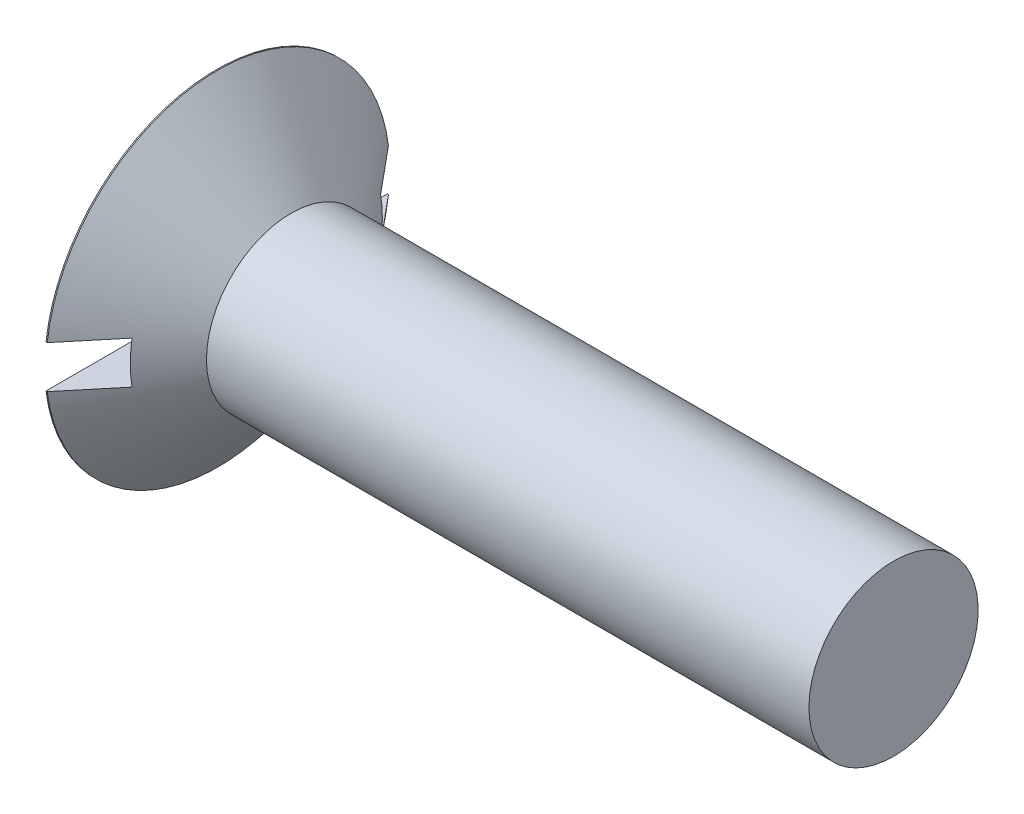
ISO-10303-21;
HEADER;
FILE_DESCRIPTION(('STEP AP214'),'2;1');
FILE_NAME('part.step','',(''),(''),'','','');
FILE_SCHEMA(('AUTOMOTIVE_DESIGN { 1 0 10303 214 1 1 1 1 }'));
ENDSEC;
DATA;
#1=APPLICATION_CONTEXT('core data for automotive mechanical design processes');
#2=APPLICATION_PROTOCOL_DEFINITION('international standard','automotive_design',2000,#1);
#3=PRODUCT_CONTEXT('',#1,'mechanical');
#4=PRODUCT('Part','Part','',(#3));
#5=PRODUCT_RELATED_PRODUCT_CATEGORY('part','',(#4));
#6=PRODUCT_DEFINITION_FORMATION('','',#4);
#7=PRODUCT_DEFINITION_CONTEXT('part definition',#1,'design');
#8=PRODUCT_DEFINITION('design','',#6,#7);
#9=PRODUCT_DEFINITION_SHAPE('','',#8);
#10=(LENGTH_UNIT() NAMED_UNIT(*) SI_UNIT(.MILLI.,.METRE.));
#11=(NAMED_UNIT(*) PLANE_ANGLE_UNIT() SI_UNIT($,.RADIAN.));
#12=(NAMED_UNIT(*) SI_UNIT($,.STERADIAN.) SOLID_ANGLE_UNIT());
#13=UNCERTAINTY_MEASURE_WITH_UNIT(LENGTH_MEASURE(1.E-05),#10,'distance_accuracy_value','');
#14=(GEOMETRIC_REPRESENTATION_CONTEXT(3) GLOBAL_UNCERTAINTY_ASSIGNED_CONTEXT((#13)) GLOBAL_UNIT_ASSIGNED_CONTEXT((#10,
#11,#12)) REPRESENTATION_CONTEXT('',''));
#15=CARTESIAN_POINT('',(0.,0.,0.));
#16=DIRECTION('',(0.,0.,1.));
#17=DIRECTION('',(1.,0.,0.));
#18=AXIS2_PLACEMENT_3D('',#15,#16,#17);
#19=CARTESIAN_POINT('',(2.2352,1.1938,-9.67739999999999));
#20=DIRECTION('',(-1.,0.,0.));
#21=DIRECTION('',(0.,0.,1.));
#22=AXIS2_PLACEMENT_3D('',#19,#20,#21);
#23=PLANE('',#22);
#24=DIRECTION('',(0.,-1.,0.));
#25=VECTOR('',#24,1.);
#26=CARTESIAN_POINT('',(2.2352,1.19379999999995,4.93366687898089));
#27=LINE('',#26,#25);
#28=CARTESIAN_POINT('',(2.2352,0.93915286624202,4.93366687898089));
#29=VERTEX_POINT('',#28);
#30=CARTESIAN_POINT('',(2.2352,-0.939152866242055,4.93366687898089));
#31=VERTEX_POINT('',#30);
#32=EDGE_CURVE('E326',#29,#31,#27,.T.);
#33=ORIENTED_EDGE('',*,*,#32,.T.);
#34=DIRECTION('',(0.,0.,-1.));
#35=VECTOR('',#34,1.);
#36=CARTESIAN_POINT('',(2.2352,-0.939152866242006,-9.6774));
#37=LINE('',#36,#35);
#38=CARTESIAN_POINT('',(2.2352,-0.939152866242041,0.939152866242038));
#39=VERTEX_POINT('',#38);
#40=EDGE_CURVE('E170',#31,#39,#37,.T.);
#41=ORIENTED_EDGE('',*,*,#40,.T.);
#42=DIRECTION('',(0.,-1.,0.));
#43=VECTOR('',#42,1.);
#44=CARTESIAN_POINT('',(2.2352,1.1938,0.939152866242037));
#45=LINE('',#44,#43);
#46=CARTESIAN_POINT('',(2.2352,-1.1938,0.939152866242037));
#47=VERTEX_POINT('',#46);
#48=EDGE_CURVE('E47',#39,#47,#45,.T.);
#49=ORIENTED_EDGE('',*,*,#48,.T.);
#50=DIRECTION('',(0.,0.,1.));
#51=VECTOR('',#50,1.);
#52=CARTESIAN_POINT('',(2.2352,-1.1938,-9.6774));
#53=LINE('',#52,#51);
#54=CARTESIAN_POINT('',(2.2352,-1.1938,6.99215244623282));
#55=VERTEX_POINT('',#54);
#56=EDGE_CURVE('E62',#47,#55,#53,.T.);
#57=ORIENTED_EDGE('',*,*,#56,.T.);
#58=CARTESIAN_POINT('',(2.2352,0.,0.));
#59=DIRECTION('',(-1.,0.,0.));
#60=DIRECTION('',(0.,0.,1.));
#61=AXIS2_PLACEMENT_3D('',#58,#59,#60);
#62=CIRCLE('',#61,7.09333167639577);
#63=CARTESIAN_POINT('',(2.2352,1.1938,6.99215244623282));
#64=VERTEX_POINT('',#63);
#65=EDGE_CURVE('E271',#64,#55,#62,.F.);
#66=ORIENTED_EDGE('',*,*,#65,.F.);
#67=DIRECTION('',(0.,0.,-1.));
#68=VECTOR('',#67,1.);
#69=CARTESIAN_POINT('',(2.2352,1.1938,9.6774));
#70=LINE('',#69,#68);
#71=CARTESIAN_POINT('',(2.2352,1.1938,0.939152866242037));
#72=VERTEX_POINT('',#71);
#73=EDGE_CURVE('E235',#64,#72,#70,.T.);
#74=ORIENTED_EDGE('',*,*,#73,.T.);
#75=CARTESIAN_POINT('',(2.2352,0.939152866242034,0.939152866242037));
#76=VERTEX_POINT('',#75);
#77=EDGE_CURVE('E11',#72,#76,#45,.T.);
#78=ORIENTED_EDGE('',*,*,#77,.T.);
#79=DIRECTION('',(0.,0.,1.));
#80=VECTOR('',#79,1.);
#81=CARTESIAN_POINT('',(2.2352,0.939152866242072,-9.67739999999999));
#82=LINE('',#81,#80);
#83=EDGE_CURVE('E327',#76,#29,#82,.T.);
#84=ORIENTED_EDGE('',*,*,#83,.T.);
#85=EDGE_LOOP('',(#33,#41,#49,#57,#66,#74,#78,#84));
#86=FACE_BOUND('',#85,.T.);
#87=ADVANCED_FACE('F39',(#86),#23,.T.);
#88=DIRECTION('',(0.,1.,0.));
#89=VECTOR('',#88,1.);
#90=CARTESIAN_POINT('',(2.2352,1.1938,-0.939152866242039));
#91=LINE('',#90,#89);
#92=CARTESIAN_POINT('',(2.2352,-1.1938,-0.939152866242039));
#93=VERTEX_POINT('',#92);
#94=CARTESIAN_POINT('',(2.2352,-0.939152866242035,-0.939152866242038));
#95=VERTEX_POINT('',#94);
#96=EDGE_CURVE('E399',#93,#95,#91,.T.);
#97=ORIENTED_EDGE('',*,*,#96,.T.);
#98=DIRECTION('',(0.,0.,-1.));
#99=VECTOR('',#98,1.);
#100=CARTESIAN_POINT('',(2.2352,-0.939152866242006,-9.6774));
#101=LINE('',#100,#99);
#102=CARTESIAN_POINT('',(2.2352,-0.939152866242022,-4.9336668789809));
#103=VERTEX_POINT('',#102);
#104=EDGE_CURVE('E196',#95,#103,#101,.T.);
#105=ORIENTED_EDGE('',*,*,#104,.T.);
#106=DIRECTION('',(0.,1.,0.));
#107=VECTOR('',#106,1.);
#108=CARTESIAN_POINT('',(2.2352,1.19379999999998,-4.93366687898089));
#109=LINE('',#108,#107);
#110=CARTESIAN_POINT('',(2.2352,0.939152866242055,-4.93366687898089));
#111=VERTEX_POINT('',#110);
#112=EDGE_CURVE('E342',#103,#111,#109,.T.);
#113=ORIENTED_EDGE('',*,*,#112,.T.);
#114=DIRECTION('',(0.,0.,1.));
#115=VECTOR('',#114,1.);
#116=CARTESIAN_POINT('',(2.2352,0.939152866242072,-9.67739999999999));
#117=LINE('',#116,#115);
#118=CARTESIAN_POINT('',(2.2352,0.939152866242041,-0.939152866242038));
#119=VERTEX_POINT('',#118);
#120=EDGE_CURVE('E332',#111,#119,#117,.T.);
#121=ORIENTED_EDGE('',*,*,#120,.T.);
#122=CARTESIAN_POINT('',(2.2352,1.1938,-0.939152866242035));
#123=VERTEX_POINT('',#122);
#124=EDGE_CURVE('E54',#119,#123,#91,.T.);
#125=ORIENTED_EDGE('',*,*,#124,.T.);
#126=CARTESIAN_POINT('',(2.2352,1.1938,-6.99215244623282));
#127=VERTEX_POINT('',#126);
#128=EDGE_CURVE('E238',#123,#127,#70,.T.);
#129=ORIENTED_EDGE('',*,*,#128,.T.);
#130=CARTESIAN_POINT('',(2.2352,-1.1938,-6.99215244623282));
#131=VERTEX_POINT('',#130);
#132=EDGE_CURVE('E275',#131,#127,#62,.F.);
#133=ORIENTED_EDGE('',*,*,#132,.F.);
#134=EDGE_CURVE('E239',#131,#93,#53,.T.);
#135=ORIENTED_EDGE('',*,*,#134,.T.);
#136=EDGE_LOOP('',(#97,#105,#113,#121,#125,#129,#133,#135));
#137=FACE_BOUND('',#136,.T.);
#138=ADVANCED_FACE('F320',(#137),#23,.T.);
#139=CARTESIAN_POINT('',(8.69008083333333,0.,0.497178541666667));
#140=DIRECTION('',(-0.0683113918583954,0.,-0.997664048536565));
#141=DIRECTION('',(-0.997664048536565,0.,0.0683113918583954));
#142=AXIS2_PLACEMENT_3D('',#139,#140,#141);
#143=PLANE('',#142);
#144=ORIENTED_EDGE('',*,*,#48,.F.);
#145=DIRECTION('',(0.995344390972083,0.0681525618022289,-0.0681525618022287));
#146=VECTOR('',#145,1.);
#147=CARTESIAN_POINT('',(8.72380707400527,-0.494869260856328,0.494869260856327));
#148=LINE('',#147,#146);
#149=CARTESIAN_POINT('',(7.9756,-0.546100000000002,0.546099999999999));
#150=VERTEX_POINT('',#149);
#151=EDGE_CURVE('E168',#39,#150,#148,.T.);
#152=ORIENTED_EDGE('',*,*,#151,.T.);
#153=DIRECTION('',(0.793328420082592,0.606365671400707,-0.0543202580629801));
#154=VECTOR('',#153,1.);
#155=CARTESIAN_POINT('',(0.,-6.6421,1.0922));
#156=LINE('',#155,#154);
#157=CARTESIAN_POINT('',(0.,-6.6421,1.0922));
#158=VERTEX_POINT('',#157);
#159=EDGE_CURVE('E193',#158,#150,#156,.T.);
#160=ORIENTED_EDGE('',*,*,#159,.F.);
#161=DIRECTION('',(0.,-1.,0.));
#162=VECTOR('',#161,1.);
#163=CARTESIAN_POINT('',(0.,6.6421,1.0922));
#164=LINE('',#163,#162);
#165=CARTESIAN_POINT('',(0.,-1.1938,1.0922));
#166=VERTEX_POINT('',#165);
#167=EDGE_CURVE('E354',#166,#158,#164,.T.);
#168=ORIENTED_EDGE('',*,*,#167,.F.);
#169=DIRECTION('',(0.997664048536565,0.,-0.0683113918583954));
#170=VECTOR('',#169,1.);
#171=CARTESIAN_POINT('',(2.95873739744039,-1.1938,0.889611292850418));
#172=LINE('',#171,#170);
#173=EDGE_CURVE('E230',#166,#47,#172,.T.);
#174=ORIENTED_EDGE('',*,*,#173,.T.);
#175=EDGE_LOOP('',(#144,#152,#160,#168,#174));
#176=FACE_BOUND('',#175,.T.);
#177=ADVANCED_FACE('F191',(#176),#143,.T.);
#178=DIRECTION('',(0.793328420082592,-0.606365671400707,-0.05432025806298));
#179=VECTOR('',#178,1.);
#180=CARTESIAN_POINT('',(0.,6.6421,1.0922));
#181=LINE('',#180,#179);
#182=CARTESIAN_POINT('',(0.,6.6421,1.0922));
#183=VERTEX_POINT('',#182);
#184=CARTESIAN_POINT('',(7.9756,0.546100000000001,0.5461));
#185=VERTEX_POINT('',#184);
#186=EDGE_CURVE('E216',#183,#185,#181,.T.);
#187=ORIENTED_EDGE('',*,*,#186,.T.);
#188=DIRECTION('',(-0.995344390972083,0.0681525618022283,0.0681525618022286));
#189=VECTOR('',#188,1.);
#190=CARTESIAN_POINT('',(8.72380707400527,0.494869260856325,0.494869260856327));
#191=LINE('',#190,#189);
#192=EDGE_CURVE('E338',#185,#76,#191,.T.);
#193=ORIENTED_EDGE('',*,*,#192,.T.);
#194=ORIENTED_EDGE('',*,*,#77,.F.);
#195=DIRECTION('',(-0.997664048536565,0.,0.0683113918583954));
#196=VECTOR('',#195,1.);
#197=CARTESIAN_POINT('',(1.63967255629894,1.1938,0.979929426877621));
#198=LINE('',#197,#196);
#199=CARTESIAN_POINT('',(0.,1.1938,1.0922));
#200=VERTEX_POINT('',#199);
#201=EDGE_CURVE('E232',#72,#200,#198,.T.);
#202=ORIENTED_EDGE('',*,*,#201,.T.);
#203=EDGE_CURVE('E355',#183,#200,#164,.T.);
#204=ORIENTED_EDGE('',*,*,#203,.F.);
#205=EDGE_LOOP('',(#187,#193,#194,#202,#204));
#206=FACE_BOUND('',#205,.T.);
#207=ADVANCED_FACE('F375',(#206),#143,.T.);
#208=CARTESIAN_POINT('',(8.69008083333333,0.,-0.497178541666667));
#209=DIRECTION('',(-0.0683113918583953,0.,0.997664048536565));
#210=DIRECTION('',(0.997664048536565,0.,0.0683113918583953));
#211=AXIS2_PLACEMENT_3D('',#208,#209,#210);
#212=PLANE('',#211);
#213=DIRECTION('',(0.793328420082592,0.606365671400707,0.0543202580629799));
#214=VECTOR('',#213,1.);
#215=CARTESIAN_POINT('',(0.,-6.6421,-1.0922));
#216=LINE('',#215,#214);
#217=CARTESIAN_POINT('',(0.,-6.6421,-1.0922));
#218=VERTEX_POINT('',#217);
#219=CARTESIAN_POINT('',(7.9756,-0.5461,-0.5461));
#220=VERTEX_POINT('',#219);
#221=EDGE_CURVE('E211',#218,#220,#216,.T.);
#222=ORIENTED_EDGE('',*,*,#221,.T.);
#223=DIRECTION('',(-0.995344390972083,-0.0681525618022284,-0.0681525618022285));
#224=VECTOR('',#223,1.);
#225=CARTESIAN_POINT('',(8.72380707400527,-0.494869260856325,-0.494869260856327));
#226=LINE('',#225,#224);
#227=EDGE_CURVE('E345',#220,#95,#226,.T.);
#228=ORIENTED_EDGE('',*,*,#227,.T.);
#229=ORIENTED_EDGE('',*,*,#96,.F.);
#230=DIRECTION('',(-0.997664048536565,0.,-0.0683113918583953));
#231=VECTOR('',#230,1.);
#232=CARTESIAN_POINT('',(1.63967255629895,-1.1938,-0.979929426877619));
#233=LINE('',#232,#231);
#234=CARTESIAN_POINT('',(0.,-1.1938,-1.0922));
#235=VERTEX_POINT('',#234);
#236=EDGE_CURVE('E226',#93,#235,#233,.T.);
#237=ORIENTED_EDGE('',*,*,#236,.T.);
#238=DIRECTION('',(0.,1.,0.));
#239=VECTOR('',#238,1.);
#240=CARTESIAN_POINT('',(0.,-6.6421,-1.0922));
#241=LINE('',#240,#239);
#242=EDGE_CURVE('E214',#218,#235,#241,.T.);
#243=ORIENTED_EDGE('',*,*,#242,.F.);
#244=EDGE_LOOP('',(#222,#228,#229,#237,#243));
#245=FACE_BOUND('',#244,.T.);
#246=ADVANCED_FACE('F398',(#245),#212,.T.);
#247=ORIENTED_EDGE('',*,*,#124,.F.);
#248=DIRECTION('',(0.995344390972083,-0.0681525618022288,0.0681525618022285));
#249=VECTOR('',#248,1.);
#250=CARTESIAN_POINT('',(8.72380707400527,0.494869260856329,-0.494869260856327));
#251=LINE('',#250,#249);
#252=CARTESIAN_POINT('',(7.9756,0.546100000000002,-0.546099999999998));
#253=VERTEX_POINT('',#252);
#254=EDGE_CURVE('E328',#119,#253,#251,.T.);
#255=ORIENTED_EDGE('',*,*,#254,.T.);
#256=DIRECTION('',(0.793328420082592,-0.606365671400707,0.0543202580629799));
#257=VECTOR('',#256,1.);
#258=CARTESIAN_POINT('',(0.,6.6421,-1.0922));
#259=LINE('',#258,#257);
#260=CARTESIAN_POINT('',(0.,6.6421,-1.0922));
#261=VERTEX_POINT('',#260);
#262=EDGE_CURVE('E205',#261,#253,#259,.T.);
#263=ORIENTED_EDGE('',*,*,#262,.F.);
#264=CARTESIAN_POINT('',(0.,1.1938,-1.0922));
#265=VERTEX_POINT('',#264);
#266=EDGE_CURVE('E210',#265,#261,#241,.T.);
#267=ORIENTED_EDGE('',*,*,#266,.F.);
#268=DIRECTION('',(0.997664048536565,0.,0.0683113918583953));
#269=VECTOR('',#268,1.);
#270=CARTESIAN_POINT('',(2.95873739744039,1.1938,-0.88961129285042));
#271=LINE('',#270,#269);
#272=EDGE_CURVE('E228',#265,#123,#271,.T.);
#273=ORIENTED_EDGE('',*,*,#272,.T.);
#274=EDGE_LOOP('',(#247,#255,#263,#267,#273));
#275=FACE_BOUND('',#274,.T.);
#276=ADVANCED_FACE('F385',(#275),#212,.T.);
#277=CARTESIAN_POINT('',(0.,0.,0.));
#278=DIRECTION('',(-1.,0.,0.));
#279=DIRECTION('',(0.,0.,1.));
#280=AXIS2_PLACEMENT_3D('',#277,#278,#279);
#281=PLANE('',#280);
#282=DIRECTION('',(0.,0.,1.));
#283=VECTOR('',#282,1.);
#284=CARTESIAN_POINT('',(0.,6.6421,-1.0922));
#285=LINE('',#284,#283);
#286=EDGE_CURVE('E351',#261,#183,#285,.T.);
#287=ORIENTED_EDGE('',*,*,#286,.T.);
#288=ORIENTED_EDGE('',*,*,#203,.T.);
#289=DIRECTION('',(0.,0.,-1.));
#290=VECTOR('',#289,1.);
#291=CARTESIAN_POINT('',(0.,1.1938,9.6774));
#292=LINE('',#291,#290);
#293=CARTESIAN_POINT('',(0.,1.1938,9.60348438432634));
#294=VERTEX_POINT('',#293);
#295=EDGE_CURVE('E243',#294,#200,#292,.T.);
#296=ORIENTED_EDGE('',*,*,#295,.F.);
#297=CARTESIAN_POINT('',(0.,0.,0.));
#298=DIRECTION('',(-1.,0.,0.));
#299=DIRECTION('',(0.,0.,1.));
#300=AXIS2_PLACEMENT_3D('',#297,#298,#299);
#301=CIRCLE('',#300,9.6774);
#302=CARTESIAN_POINT('',(0.,1.1938,-9.60348438432634));
#303=VERTEX_POINT('',#302);
#304=EDGE_CURVE('E270',#294,#303,#301,.T.);
#305=ORIENTED_EDGE('',*,*,#304,.T.);
#306=EDGE_CURVE('E234',#265,#303,#292,.T.);
#307=ORIENTED_EDGE('',*,*,#306,.F.);
#308=ORIENTED_EDGE('',*,*,#266,.T.);
#309=EDGE_LOOP('',(#287,#288,#296,#305,#307,#308));
#310=FACE_BOUND('',#309,.T.);
#311=ADVANCED_FACE('F41',(#310),#281,.T.);
#312=DIRECTION('',(0.,0.,1.));
#313=VECTOR('',#312,1.);
#314=CARTESIAN_POINT('',(0.,-1.1938,-9.6774));
#315=LINE('',#314,#313);
#316=CARTESIAN_POINT('',(0.,-1.1938,9.60348438432634));
#317=VERTEX_POINT('',#316);
#318=EDGE_CURVE('E246',#166,#317,#315,.T.);
#319=ORIENTED_EDGE('',*,*,#318,.F.);
#320=ORIENTED_EDGE('',*,*,#167,.T.);
#321=DIRECTION('',(0.,0.,-1.));
#322=VECTOR('',#321,1.);
#323=CARTESIAN_POINT('',(0.,-6.6421,1.0922));
#324=LINE('',#323,#322);
#325=EDGE_CURVE('E209',#158,#218,#324,.T.);
#326=ORIENTED_EDGE('',*,*,#325,.T.);
#327=ORIENTED_EDGE('',*,*,#242,.T.);
#328=CARTESIAN_POINT('',(0.,-1.1938,-9.60348438432634));
#329=VERTEX_POINT('',#328);
#330=EDGE_CURVE('E247',#329,#235,#315,.T.);
#331=ORIENTED_EDGE('',*,*,#330,.F.);
#332=EDGE_CURVE('E267',#329,#317,#301,.T.);
#333=ORIENTED_EDGE('',*,*,#332,.T.);
#334=EDGE_LOOP('',(#319,#320,#326,#327,#331,#333));
#335=FACE_BOUND('',#334,.T.);
#336=ADVANCED_FACE('F305',(#335),#281,.T.);
#337=CARTESIAN_POINT('',(2.2352,1.1938,9.6774));
#338=DIRECTION('',(0.,1.,0.));
#339=DIRECTION('',(0.,0.,1.));
#340=AXIS2_PLACEMENT_3D('',#337,#338,#339);
#341=PLANE('',#340);
#342=ORIENTED_EDGE('',*,*,#201,.F.);
#343=ORIENTED_EDGE('',*,*,#73,.F.);
#344=CARTESIAN_POINT('',(-9.76654593164914,1.1938,-21.3631259383791));
#345=CARTESIAN_POINT('',(-9.09525937896427,1.1938,-20.5618561872628));
#346=CARTESIAN_POINT('',(-8.42402942184396,1.1938,-19.7605389922674));
#347=CARTESIAN_POINT('',(-7.08174656529872,1.1938,-18.1577081627407));
#348=CARTESIAN_POINT('',(-6.410693672967,1.1938,-17.3561945222694));
#349=CARTESIAN_POINT('',(-5.06835999478433,1.1938,-15.7523090009415));
#350=CARTESIAN_POINT('',(-4.39707943091825,1.1938,-14.9499369342687));
#351=CARTESIAN_POINT('',(-3.05500547673588,1.1938,-13.344832799566));
#352=CARTESIAN_POINT('',(-2.38421207030887,1.1938,-12.5421007450077));
#353=CARTESIAN_POINT('',(-1.08974214453766,1.1938,-10.9914684766259));
#354=CARTESIAN_POINT('',(-0.466012830989505,1.1938,-10.2436123638055));
#355=CARTESIAN_POINT('',(0.468629921489955,1.1938,-9.12096941168539));
#356=CARTESIAN_POINT('',(0.780035340405338,1.1938,-8.74659222952008));
#357=CARTESIAN_POINT('',(1.40235767845507,1.1938,-7.99743946742865));
#358=CARTESIAN_POINT('',(1.7132746034181,1.1938,-7.62266389234697));
#359=CARTESIAN_POINT('',(2.33421374657035,1.1938,-6.87268523520887));
#360=CARTESIAN_POINT('',(2.64423633183312,1.1938,-6.49748245710988));
#361=CARTESIAN_POINT('',(3.26310212902536,1.1938,-5.74607511705371));
#362=CARTESIAN_POINT('',(3.57194528724139,1.1938,-5.36987051076495));
#363=CARTESIAN_POINT('',(4.03353158308518,1.1938,-4.80425158466735));
#364=CARTESIAN_POINT('',(4.18709974598508,1.1938,-4.61551087670477));
#365=CARTESIAN_POINT('',(4.4934425309929,1.1938,-4.23738693696583));
#366=CARTESIAN_POINT('',(4.64621715651197,1.1938,-4.04800370795726));
#367=CARTESIAN_POINT('',(4.95058145187337,1.1938,-3.66830924323743));
#368=CARTESIAN_POINT('',(5.10217120583669,1.1938,-3.47799807499275));
#369=CARTESIAN_POINT('',(5.40351985730696,1.1938,-3.09593308429033));
#370=CARTESIAN_POINT('',(5.55327881261173,1.1938,-2.90417930768568));
#371=CARTESIAN_POINT('',(5.73503949390202,1.1938,-2.66748522542514));
#372=CARTESIAN_POINT('',(5.7685380756654,1.1938,-2.62369463527218));
#373=CARTESIAN_POINT('',(5.83534437577694,1.1938,-2.53596777529053));
#374=CARTESIAN_POINT('',(5.86865209308634,1.1938,-2.49203150467103));
#375=CARTESIAN_POINT('',(5.96825558737328,1.1938,-2.35996763028417));
#376=CARTESIAN_POINT('',(6.03422528026106,1.1938,-2.2715933118258));
#377=CARTESIAN_POINT('',(6.1655598629118,1.1938,-2.09319681022266));
#378=CARTESIAN_POINT('',(6.23091437982306,1.1938,-2.00316697271865));
#379=CARTESIAN_POINT('',(6.35992402493566,1.1938,-1.82192968945906));
#380=CARTESIAN_POINT('',(6.42357962679466,1.1938,-1.73072258267317));
#381=CARTESIAN_POINT('',(6.54895917751627,1.1938,-1.54585737920636));
#382=CARTESIAN_POINT('',(6.61066232471778,1.1938,-1.4521851040837));
#383=CARTESIAN_POINT('',(6.73033793041619,1.1938,-1.2622703295857));
#384=CARTESIAN_POINT('',(6.78830535652416,1.1938,-1.16602460050921));
#385=CARTESIAN_POINT('',(6.87032154010654,1.1938,-1.01940163786976));
#386=CARTESIAN_POINT('',(6.89673746242748,1.1938,-0.970361294352434));
#387=CARTESIAN_POINT('',(6.94753509366566,1.1938,-0.871242137065956));
#388=CARTESIAN_POINT('',(6.97191636263843,1.1938,-0.821163101612475));
#389=CARTESIAN_POINT('',(7.04101569893722,1.1938,-0.669329881550796));
#390=CARTESIAN_POINT('',(7.08187978249657,1.1938,-0.565655074895695));
#391=CARTESIAN_POINT('',(7.12649625042963,1.1938,-0.417525005421814));
#392=CARTESIAN_POINT('',(7.13772030765905,1.1938,-0.375315946700829));
#393=CARTESIAN_POINT('',(7.15690825639771,1.1938,-0.290148086197977));
#394=CARTESIAN_POINT('',(7.16487217380331,1.1938,-0.247189290374347));
#395=CARTESIAN_POINT('',(7.17705987506851,1.1938,-0.160931262036988));
#396=CARTESIAN_POINT('',(7.18130019489879,1.1938,-0.117634405031511));
#397=CARTESIAN_POINT('',(7.18581997140462,1.1938,-0.0308320584269585));
#398=CARTESIAN_POINT('',(7.18609962730917,1.1938,0.012673420567904));
#399=CARTESIAN_POINT('',(7.18267879720996,1.1938,0.0995364340264344));
#400=CARTESIAN_POINT('',(7.17897720385541,1.1938,0.142893923962496));
#401=CARTESIAN_POINT('',(7.16783852752721,1.1938,0.229128576149828));
#402=CARTESIAN_POINT('',(7.16040045523447,1.1938,0.27200560811339));
#403=CARTESIAN_POINT('',(7.14217709888898,1.1938,0.357256963356369));
#404=CARTESIAN_POINT('',(7.13137514507676,1.1938,0.39962766705218));
#405=CARTESIAN_POINT('',(7.10695142432286,1.1938,0.483527898356983));
#406=CARTESIAN_POINT('',(7.09333011278446,1.1938,0.525057560629226));
#407=CARTESIAN_POINT('',(7.05155357221496,1.1938,0.641262683137298));
#408=CARTESIAN_POINT('',(7.02069143144381,1.1938,0.714961370983384));
#409=CARTESIAN_POINT('',(6.95370460919302,1.1938,0.859951367703662));
#410=CARTESIAN_POINT('',(6.91757377890332,1.1938,0.931239742212284));
#411=CARTESIAN_POINT('',(6.84158229234983,1.1938,1.07213929396108));
#412=CARTESIAN_POINT('',(6.80170762713691,1.1938,1.1417428379471));
#413=CARTESIAN_POINT('',(6.71946088773381,1.1938,1.27940009701406));
#414=CARTESIAN_POINT('',(6.67708995170407,1.1938,1.34745449909285));
#415=CARTESIAN_POINT('',(6.5900430747082,1.1938,1.48318189948864));
#416=CARTESIAN_POINT('',(6.54534611851475,1.1938,1.55084134781466));
#417=CARTESIAN_POINT('',(6.45459267427967,1.1938,1.68524729097075));
#418=CARTESIAN_POINT('',(6.40853606204155,1.1938,1.75199370158027));
#419=CARTESIAN_POINT('',(6.31551801715653,1.1938,1.88460319658262));
#420=CARTESIAN_POINT('',(6.26855912382869,1.1938,1.95046806699275));
#421=CARTESIAN_POINT('',(6.17385893762874,1.1938,2.08162757987045));
#422=CARTESIAN_POINT('',(6.12611767670796,1.1938,2.14692224545867));
#423=CARTESIAN_POINT('',(5.98410270480833,1.1938,2.33925290234634));
#424=CARTESIAN_POINT('',(5.88896693615856,1.1938,2.4656518413085));
#425=CARTESIAN_POINT('',(5.69717733241733,1.1938,2.71729450061664));
#426=CARTESIAN_POINT('',(5.60052343881202,1.1938,2.84253817613796));
#427=CARTESIAN_POINT('',(5.40615432485478,1.1938,3.09222128667673));
#428=CARTESIAN_POINT('',(5.30843898444181,1.1938,3.21666062812193));
#429=CARTESIAN_POINT('',(5.11225222530465,1.1938,3.46494232473051));
#430=CARTESIAN_POINT('',(5.01378080129258,1.1938,3.58878467570879));
#431=CARTESIAN_POINT('',(4.71730922276825,1.1938,3.95993661980433));
#432=CARTESIAN_POINT('',(4.51847832872611,1.1938,4.20658220685803));
#433=CARTESIAN_POINT('',(4.11953298785209,1.1938,4.69880256251823));
#434=CARTESIAN_POINT('',(3.91941862833607,1.1938,4.94437740209918));
#435=CARTESIAN_POINT('',(3.52060792575742,1.1938,5.43207466293569));
#436=CARTESIAN_POINT('',(3.32192101760868,1.1938,5.67420480254494));
#437=CARTESIAN_POINT('',(2.92398116297748,1.1938,6.15800627813386));
#438=CARTESIAN_POINT('',(2.72472820660204,1.1938,6.39967760597007));
#439=CARTESIAN_POINT('',(2.12655720032307,1.1938,7.12398599686619));
#440=CARTESIAN_POINT('',(1.72704846978457,1.1938,7.60613510378066));
#441=CARTESIAN_POINT('',(0.871046814390566,1.1938,8.63731923425449));
#442=CARTESIAN_POINT('',(0.414424045188351,1.1938,9.18624635470304));
#443=CARTESIAN_POINT('',(-0.499483291949484,1.1938,10.2835513722639));
#444=CARTESIAN_POINT('',(-0.956767861379917,1.1938,10.8319292681309));
#445=CARTESIAN_POINT('',(-2.32939847374105,1.1938,12.4767584040929));
#446=CARTESIAN_POINT('',(-3.24535253425598,1.1938,13.5727021058739));
#447=CARTESIAN_POINT('',(-5.09535146208239,1.1938,15.7847101010366));
#448=CARTESIAN_POINT('',(-6.02941052973186,1.1938,16.9007625112222));
#449=CARTESIAN_POINT('',(-7.43073742945754,1.1938,18.5744595203244));
#450=CARTESIAN_POINT('',(-7.89784127784283,1.1938,19.132241416059));
#451=CARTESIAN_POINT('',(-8.83213491623696,1.1938,20.2477329688739));
#452=CARTESIAN_POINT('',(-9.29932470622239,1.1938,20.805442625974));
#453=CARTESIAN_POINT('',(-9.76654593164914,1.1938,21.3631259383791));
#454=B_SPLINE_CURVE_WITH_KNOTS('',3,(#344,#345,#346,#347,#348,#349,#350,#351,#352,#353,#354,
#355,#356,#357,#358,#359,#360,#361,#362,#363,#364,#365,#366,#367,#368,#369,#370,#371,#372,#373,
#374,#375,#376,#377,#378,#379,#380,#381,#382,#383,#384,#385,#386,#387,#388,#389,#390,#391,#392,
#393,#394,#395,#396,#397,#398,#399,#400,#401,#402,#403,#404,#405,#406,#407,#408,#409,#410,#411,
#412,#413,#414,#415,#416,#417,#418,#419,#420,#421,#422,#423,#424,#425,#426,#427,#428,#429,#430,
#431,#432,#433,#434,#435,#436,#437,#438,#439,#440,#441,#442,#443,#444,#445,#446,#447,#448,#449,
#450,#451,#452,#453),.UNSPECIFIED.,.F.,.F.,(4,2,2,2,2,2,2,2,2,2,2,2,2,2,2,2,2,2,2,2,2,2,2,2,2,2,
2,2,2,2,2,2,2,2,2,2,2,2,2,2,2,2,2,2,2,2,2,2,2,2,2,2,2,2,4),(0.,3.13590972967681,
6.27193024983931,9.41036393077616,12.5486886077346,15.4701501185137,16.9310347189183,
18.3919017536911,19.852044722728,21.3122534149416,22.0422220793259,22.7721876032245,
23.5021008230668,24.231990939925,24.39739280978,24.5627955789655,24.8936327210894,
25.2273703299122,25.5610138995455,25.8974694346029,26.2343691227893,26.4014275322946,
26.5685219710389,26.9015846025692,27.0325102656921,27.163434888809,27.2937751103023,
27.4241087754088,27.554478701098,27.6848831634443,27.815944415997,27.946984515076,
28.1863394742223,28.4259760413417,28.6665480374595,28.9070111825094,29.150259810119,
29.3935307262178,29.6361957345903,29.8788508572731,30.3534327917803,30.8280330634426,
31.3026875883677,31.7773454359548,32.7277625128649,33.6781156033537,34.6177585666301,
35.5574180545877,37.435892529325,39.5779535130433,41.7200193426254,46.0049431725074,
50.3709886613029,52.5535925619314,54.7361958687159),.UNSPECIFIED.);
#455=CARTESIAN_POINT('',(0.0669092227268023,1.1938,9.60348438432635));
#456=VERTEX_POINT('',#455);
#457=EDGE_CURVE('E283',#64,#456,#454,.T.);
#458=ORIENTED_EDGE('',*,*,#457,.T.);
#459=DIRECTION('',(-1.,0.,0.));
#460=VECTOR('',#459,1.);
#461=CARTESIAN_POINT('',(-6.34999999999999,1.1938,9.60348438432634));
#462=LINE('',#461,#460);
#463=EDGE_CURVE('E253',#456,#294,#462,.T.);
#464=ORIENTED_EDGE('',*,*,#463,.T.);
#465=ORIENTED_EDGE('',*,*,#295,.T.);
#466=EDGE_LOOP('',(#342,#343,#458,#464,#465));
#467=FACE_BOUND('',#466,.T.);
#468=ADVANCED_FACE('F301',(#467),#341,.F.);
#469=ORIENTED_EDGE('',*,*,#272,.F.);
#470=ORIENTED_EDGE('',*,*,#306,.T.);
#471=DIRECTION('',(-1.,0.,0.));
#472=VECTOR('',#471,1.);
#473=CARTESIAN_POINT('',(-6.34999999999999,1.1938,-9.60348438432634));
#474=LINE('',#473,#472);
#475=CARTESIAN_POINT('',(0.0669092227268023,1.1938,-9.60348438432635));
#476=VERTEX_POINT('',#475);
#477=EDGE_CURVE('E255',#303,#476,#474,.F.);
#478=ORIENTED_EDGE('',*,*,#477,.T.);
#479=EDGE_CURVE('E402',#476,#127,#454,.T.);
#480=ORIENTED_EDGE('',*,*,#479,.T.);
#481=ORIENTED_EDGE('',*,*,#128,.F.);
#482=EDGE_LOOP('',(#469,#470,#478,#480,#481));
#483=FACE_BOUND('',#482,.T.);
#484=ADVANCED_FACE('F298',(#483),#341,.F.);
#485=CARTESIAN_POINT('',(2.2352,-1.1938,-9.6774));
#486=DIRECTION('',(0.,-1.,0.));
#487=DIRECTION('',(0.,0.,-1.));
#488=AXIS2_PLACEMENT_3D('',#485,#486,#487);
#489=PLANE('',#488);
#490=ORIENTED_EDGE('',*,*,#173,.F.);
#491=ORIENTED_EDGE('',*,*,#318,.T.);
#492=DIRECTION('',(-1.,0.,0.));
#493=VECTOR('',#492,1.);
#494=CARTESIAN_POINT('',(-6.34999999999999,-1.1938,9.60348438432634));
#495=LINE('',#494,#493);
#496=CARTESIAN_POINT('',(0.0669092227268015,-1.1938,9.60348438432635));
#497=VERTEX_POINT('',#496);
#498=EDGE_CURVE('E251',#317,#497,#495,.F.);
#499=ORIENTED_EDGE('',*,*,#498,.T.);
#500=CARTESIAN_POINT('',(-9.76654593164914,-1.1938,21.3631259383791));
#501=CARTESIAN_POINT('',(-9.09525937896427,-1.1938,20.5618561872628));
#502=CARTESIAN_POINT('',(-8.42402942184396,-1.1938,19.7605389922674));
#503=CARTESIAN_POINT('',(-7.08174656529873,-1.1938,18.1577081627407));
#504=CARTESIAN_POINT('',(-6.41069367296701,-1.1938,17.3561945222694));
#505=CARTESIAN_POINT('',(-5.06835999478435,-1.1938,15.7523090009415));
#506=CARTESIAN_POINT('',(-4.39707943091827,-1.1938,14.9499369342687));
#507=CARTESIAN_POINT('',(-3.05500547673591,-1.1938,13.3448327995661));
#508=CARTESIAN_POINT('',(-2.3842120703089,-1.1938,12.5421007450078));
#509=CARTESIAN_POINT('',(-1.08974214453769,-1.1938,10.9914684766259));
#510=CARTESIAN_POINT('',(-0.466012830989533,-1.1938,10.2436123638055));
#511=CARTESIAN_POINT('',(0.46862992148993,-1.1938,9.12096941168542));
#512=CARTESIAN_POINT('',(0.780035340405314,-1.1938,8.74659222952011));
#513=CARTESIAN_POINT('',(1.40235767845505,-1.1938,7.99743946742867));
#514=CARTESIAN_POINT('',(1.71327460341808,-1.1938,7.62266389234699));
#515=CARTESIAN_POINT('',(2.33421374657033,-1.1938,6.87268523520889));
#516=CARTESIAN_POINT('',(2.64423633183311,-1.1938,6.4974824571099));
#517=CARTESIAN_POINT('',(3.26310212902535,-1.1938,5.74607511705372));
#518=CARTESIAN_POINT('',(3.57194528724138,-1.1938,5.36987051076496));
#519=CARTESIAN_POINT('',(4.03353158308518,-1.1938,4.80425158466736));
#520=CARTESIAN_POINT('',(4.18709974598507,-1.1938,4.61551087670478));
#521=CARTESIAN_POINT('',(4.4934425309929,-1.1938,4.23738693696584));
#522=CARTESIAN_POINT('',(4.64621715651197,-1.1938,4.04800370795726));
#523=CARTESIAN_POINT('',(4.95058145187336,-1.1938,3.66830924323743));
#524=CARTESIAN_POINT('',(5.10217120583669,-1.1938,3.47799807499276));
#525=CARTESIAN_POINT('',(5.40351985730696,-1.1938,3.09593308429033));
#526=CARTESIAN_POINT('',(5.55327881261173,-1.1938,2.90417930768568));
#527=CARTESIAN_POINT('',(5.73503949390202,-1.1938,2.66748522542514));
#528=CARTESIAN_POINT('',(5.7685380756654,-1.1938,2.62369463527218));
#529=CARTESIAN_POINT('',(5.83534437577694,-1.1938,2.53596777529053));
#530=CARTESIAN_POINT('',(5.86865209308634,-1.1938,2.49203150467103));
#531=CARTESIAN_POINT('',(5.96825558737327,-1.1938,2.35996763028417));
#532=CARTESIAN_POINT('',(6.03422528026106,-1.1938,2.2715933118258));
#533=CARTESIAN_POINT('',(6.1655598629118,-1.1938,2.09319681022266));
#534=CARTESIAN_POINT('',(6.23091437982306,-1.1938,2.00316697271865));
#535=CARTESIAN_POINT('',(6.35992402493566,-1.1938,1.82192968945906));
#536=CARTESIAN_POINT('',(6.42357962679466,-1.1938,1.73072258267317));
#537=CARTESIAN_POINT('',(6.54895917751627,-1.1938,1.54585737920636));
#538=CARTESIAN_POINT('',(6.61066232471778,-1.1938,1.4521851040837));
#539=CARTESIAN_POINT('',(6.73033793041618,-1.1938,1.2622703295857));
#540=CARTESIAN_POINT('',(6.78830535652416,-1.1938,1.16602460050921));
#541=CARTESIAN_POINT('',(6.87032154010654,-1.1938,1.01940163786976));
#542=CARTESIAN_POINT('',(6.89673746242748,-1.1938,0.970361294352433));
#543=CARTESIAN_POINT('',(6.94753509366565,-1.1938,0.871242137065955));
#544=CARTESIAN_POINT('',(6.97191636263843,-1.1938,0.821163101612474));
#545=CARTESIAN_POINT('',(7.04101569893722,-1.1938,0.669329881550796));
#546=CARTESIAN_POINT('',(7.08187978249657,-1.1938,0.565655074895694));
#547=CARTESIAN_POINT('',(7.12649625042963,-1.1938,0.417525005421814));
#548=CARTESIAN_POINT('',(7.13772030765905,-1.1938,0.375315946700828));
#549=CARTESIAN_POINT('',(7.15690825639771,-1.1938,0.290148086197976));
#550=CARTESIAN_POINT('',(7.16487217380331,-1.1938,0.247189290374345));
#551=CARTESIAN_POINT('',(7.17705987506851,-1.1938,0.160931262036987));
#552=CARTESIAN_POINT('',(7.18130019489879,-1.1938,0.117634405031509));
#553=CARTESIAN_POINT('',(7.18581997140462,-1.1938,0.0308320584269569));
#554=CARTESIAN_POINT('',(7.18609962730917,-1.1938,-0.0126734205679056));
#555=CARTESIAN_POINT('',(7.18267879720996,-1.1938,-0.0995364340264364));
#556=CARTESIAN_POINT('',(7.17897720385541,-1.1938,-0.142893923962498));
#557=CARTESIAN_POINT('',(7.16783852752721,-1.1938,-0.22912857614983));
#558=CARTESIAN_POINT('',(7.16040045523447,-1.1938,-0.272005608113391));
#559=CARTESIAN_POINT('',(7.14217709888898,-1.1938,-0.35725696335637));
#560=CARTESIAN_POINT('',(7.13137514507676,-1.1938,-0.39962766705218));
#561=CARTESIAN_POINT('',(7.10695142432286,-1.1938,-0.483527898356984));
#562=CARTESIAN_POINT('',(7.09333011278445,-1.1938,-0.525057560629228));
#563=CARTESIAN_POINT('',(7.05155357221496,-1.1938,-0.641262683137301));
#564=CARTESIAN_POINT('',(7.02069143144381,-1.1938,-0.714961370983388));
#565=CARTESIAN_POINT('',(6.95370460919302,-1.1938,-0.859951367703667));
#566=CARTESIAN_POINT('',(6.91757377890332,-1.1938,-0.931239742212289));
#567=CARTESIAN_POINT('',(6.84158229234983,-1.1938,-1.07213929396108));
#568=CARTESIAN_POINT('',(6.8017076271369,-1.1938,-1.1417428379471));
#569=CARTESIAN_POINT('',(6.71946088773381,-1.1938,-1.27940009701407));
#570=CARTESIAN_POINT('',(6.67708995170407,-1.1938,-1.34745449909286));
#571=CARTESIAN_POINT('',(6.59004307470819,-1.1938,-1.48318189948865));
#572=CARTESIAN_POINT('',(6.54534611851474,-1.1938,-1.55084134781466));
#573=CARTESIAN_POINT('',(6.45459267427966,-1.1938,-1.68524729097075));
#574=CARTESIAN_POINT('',(6.40853606204154,-1.1938,-1.75199370158028));
#575=CARTESIAN_POINT('',(6.31551801715652,-1.1938,-1.88460319658263));
#576=CARTESIAN_POINT('',(6.26855912382869,-1.1938,-1.95046806699276));
#577=CARTESIAN_POINT('',(6.17385893762874,-1.1938,-2.08162757987046));
#578=CARTESIAN_POINT('',(6.12611767670795,-1.1938,-2.14692224545868));
#579=CARTESIAN_POINT('',(5.98410270480832,-1.1938,-2.33925290234635));
#580=CARTESIAN_POINT('',(5.88896693615855,-1.1938,-2.46565184130851));
#581=CARTESIAN_POINT('',(5.69717733241732,-1.1938,-2.71729450061666));
#582=CARTESIAN_POINT('',(5.60052343881201,-1.1938,-2.84253817613797));
#583=CARTESIAN_POINT('',(5.40615432485477,-1.1938,-3.09222128667674));
#584=CARTESIAN_POINT('',(5.3084389844418,-1.1938,-3.21666062812194));
#585=CARTESIAN_POINT('',(5.11225222530464,-1.1938,-3.46494232473053));
#586=CARTESIAN_POINT('',(5.01378080129256,-1.1938,-3.58878467570881));
#587=CARTESIAN_POINT('',(4.71730922276824,-1.1938,-3.95993661980435));
#588=CARTESIAN_POINT('',(4.51847832872609,-1.1938,-4.20658220685805));
#589=CARTESIAN_POINT('',(4.11953298785207,-1.1938,-4.69880256251826));
#590=CARTESIAN_POINT('',(3.91941862833605,-1.1938,-4.9443774020992));
#591=CARTESIAN_POINT('',(3.5206079257574,-1.1938,-5.43207466293572));
#592=CARTESIAN_POINT('',(3.32192101760866,-1.1938,-5.67420480254497));
#593=CARTESIAN_POINT('',(2.92398116297745,-1.1938,-6.15800627813389));
#594=CARTESIAN_POINT('',(2.72472820660201,-1.1938,-6.39967760597011));
#595=CARTESIAN_POINT('',(2.12655720032303,-1.1938,-7.12398599686623));
#596=CARTESIAN_POINT('',(1.72704846978453,-1.1938,-7.60613510378071));
#597=CARTESIAN_POINT('',(0.871046814390527,-1.1938,-8.63731923425454));
#598=CARTESIAN_POINT('',(0.414424045188314,-1.1938,-9.18624635470309));
#599=CARTESIAN_POINT('',(-0.499483291949518,-1.1938,-10.2835513722639));
#600=CARTESIAN_POINT('',(-0.95676786137995,-1.1938,-10.831929268131));
#601=CARTESIAN_POINT('',(-2.32939847374108,-1.1938,-12.4767584040929));
#602=CARTESIAN_POINT('',(-3.24535253425601,-1.1938,-13.5727021058739));
#603=CARTESIAN_POINT('',(-5.09535146208241,-1.1938,-15.7847101010366));
#604=CARTESIAN_POINT('',(-6.02941052973187,-1.1938,-16.9007625112222));
#605=CARTESIAN_POINT('',(-7.43073742945755,-1.1938,-18.5744595203244));
#606=CARTESIAN_POINT('',(-7.89784127784284,-1.1938,-19.132241416059));
#607=CARTESIAN_POINT('',(-8.83213491623697,-1.1938,-20.247732968874));
#608=CARTESIAN_POINT('',(-9.29932470622239,-1.1938,-20.805442625974));
#609=CARTESIAN_POINT('',(-9.76654593164914,-1.1938,-21.3631259383791));
#610=B_SPLINE_CURVE_WITH_KNOTS('',3,(#500,#501,#502,#503,#504,#505,#506,#507,#508,#509,#510,
#511,#512,#513,#514,#515,#516,#517,#518,#519,#520,#521,#522,#523,#524,#525,#526,#527,#528,#529,
#530,#531,#532,#533,#534,#535,#536,#537,#538,#539,#540,#541,#542,#543,#544,#545,#546,#547,#548,
#549,#550,#551,#552,#553,#554,#555,#556,#557,#558,#559,#560,#561,#562,#563,#564,#565,#566,#567,
#568,#569,#570,#571,#572,#573,#574,#575,#576,#577,#578,#579,#580,#581,#582,#583,#584,#585,#586,
#587,#588,#589,#590,#591,#592,#593,#594,#595,#596,#597,#598,#599,#600,#601,#602,#603,#604,#605,
#606,#607,#608,#609),.UNSPECIFIED.,.F.,.F.,(4,2,2,2,2,2,2,2,2,2,2,2,2,2,2,2,2,2,2,2,2,2,2,2,2,2,
2,2,2,2,2,2,2,2,2,2,2,2,2,2,2,2,2,2,2,2,2,2,2,2,2,2,2,2,4),(0.,3.13590972967679,
6.27193024983928,9.41036393077612,12.5486886077346,15.4701501185136,16.9310347189183,
18.391901753691,19.852044722728,21.3122534149416,22.0422220793259,22.7721876032245,
23.5021008230668,24.231990939925,24.39739280978,24.5627955789655,24.8936327210894,
25.2273703299122,25.5610138995455,25.8974694346029,26.2343691227893,26.4014275322946,
26.5685219710389,26.9015846025692,27.0325102656921,27.163434888809,27.2937751103023,
27.4241087754088,27.554478701098,27.6848831634443,27.815944415997,27.946984515076,
28.1863394742223,28.4259760413417,28.6665480374595,28.9070111825094,29.150259810119,
29.3935307262178,29.6361957345903,29.8788508572731,30.3534327917803,30.8280330634426,
31.3026875883677,31.7773454359548,32.7277625128649,33.6781156033537,34.6177585666301,
35.5574180545877,37.4358925293251,39.5779535130433,41.7200193426254,46.0049431725074,
50.3709886613029,52.5535925619314,54.7361958687159),.UNSPECIFIED.);
#611=EDGE_CURVE('E274',#497,#55,#610,.T.);
#612=ORIENTED_EDGE('',*,*,#611,.T.);
#613=ORIENTED_EDGE('',*,*,#56,.F.);
#614=EDGE_LOOP('',(#490,#491,#499,#612,#613));
#615=FACE_BOUND('',#614,.T.);
#616=ADVANCED_FACE('F293',(#615),#489,.F.);
#617=ORIENTED_EDGE('',*,*,#236,.F.);
#618=ORIENTED_EDGE('',*,*,#134,.F.);
#619=CARTESIAN_POINT('',(0.0669092227268023,-1.1938,-9.60348438432635));
#620=VERTEX_POINT('',#619);
#621=EDGE_CURVE('E284',#131,#620,#610,.T.);
#622=ORIENTED_EDGE('',*,*,#621,.T.);
#623=DIRECTION('',(-1.,0.,0.));
#624=VECTOR('',#623,1.);
#625=CARTESIAN_POINT('',(-6.34999999999999,-1.1938,-9.60348438432634));
#626=LINE('',#625,#624);
#627=EDGE_CURVE('E242',#620,#329,#626,.T.);
#628=ORIENTED_EDGE('',*,*,#627,.T.);
#629=ORIENTED_EDGE('',*,*,#330,.T.);
#630=EDGE_LOOP('',(#617,#618,#622,#628,#629));
#631=FACE_BOUND('',#630,.T.);
#632=ADVANCED_FACE('F297',(#631),#489,.F.);
#633=CARTESIAN_POINT('',(-6.34999999999999,0.,0.));
#634=DIRECTION('',(-1.,0.,0.));
#635=DIRECTION('',(0.,0.,1.));
#636=AXIS2_PLACEMENT_3D('',#633,#634,#635);
#637=CYLINDRICAL_SURFACE('',#636,9.6774);
#638=ORIENTED_EDGE('',*,*,#477,.F.);
#639=ORIENTED_EDGE('',*,*,#304,.F.);
#640=ORIENTED_EDGE('',*,*,#463,.F.);
#641=CARTESIAN_POINT('',(0.0669092227268018,0.,0.));
#642=DIRECTION('',(-1.,0.,0.));
#643=DIRECTION('',(0.,0.,1.));
#644=AXIS2_PLACEMENT_3D('',#641,#642,#643);
#645=CIRCLE('',#644,9.6774);
#646=EDGE_CURVE('E266',#456,#476,#645,.T.);
#647=ORIENTED_EDGE('',*,*,#646,.T.);
#648=EDGE_LOOP('',(#638,#639,#640,#647));
#649=FACE_BOUND('',#648,.T.);
#650=ADVANCED_FACE('F414',(#649),#637,.T.);
#651=ORIENTED_EDGE('',*,*,#498,.F.);
#652=ORIENTED_EDGE('',*,*,#332,.F.);
#653=ORIENTED_EDGE('',*,*,#627,.F.);
#654=EDGE_CURVE('E263',#620,#497,#645,.T.);
#655=ORIENTED_EDGE('',*,*,#654,.T.);
#656=EDGE_LOOP('',(#651,#652,#653,#655));
#657=FACE_BOUND('',#656,.T.);
#658=ADVANCED_FACE('F316',(#657),#637,.T.);
#659=CARTESIAN_POINT('',(0.0669092227268018,0.,0.));
#660=DIRECTION('',(-1.,0.,0.));
#661=DIRECTION('',(0.,0.,1.));
#662=AXIS2_PLACEMENT_3D('',#659,#660,#661);
#663=CONICAL_SURFACE('',#662,9.6774,0.872664625997166);
#664=ORIENTED_EDGE('',*,*,#479,.F.);
#665=ORIENTED_EDGE('',*,*,#646,.F.);
#666=ORIENTED_EDGE('',*,*,#457,.F.);
#667=ORIENTED_EDGE('',*,*,#65,.T.);
#668=ORIENTED_EDGE('',*,*,#611,.F.);
#669=ORIENTED_EDGE('',*,*,#654,.F.);
#670=ORIENTED_EDGE('',*,*,#621,.F.);
#671=ORIENTED_EDGE('',*,*,#132,.T.);
#672=EDGE_LOOP('',(#664,#665,#666,#667,#668,#669,#670,#671));
#673=FACE_BOUND('',#672,.T.);
#674=CARTESIAN_POINT('',(4.191,0.,0.));
#675=DIRECTION('',(-1.,0.,0.));
#676=DIRECTION('',(0.,0.,1.));
#677=AXIS2_PLACEMENT_3D('',#674,#675,#676);
#678=CIRCLE('',#677,4.7625);
#679=CARTESIAN_POINT('',(4.191,0.,4.7625));
#680=VERTEX_POINT('',#679);
#681=EDGE_CURVE('E260',#680,#680,#678,.T.);
#682=ORIENTED_EDGE('',*,*,#681,.T.);
#683=EDGE_LOOP('',(#682));
#684=FACE_BOUND('',#683,.T.);
#685=ADVANCED_FACE('F290',(#673,#684),#663,.T.);
#686=CARTESIAN_POINT('',(-6.34999999999999,0.,0.));
#687=DIRECTION('',(-1.,0.,0.));
#688=DIRECTION('',(0.,0.,1.));
#689=AXIS2_PLACEMENT_3D('',#686,#687,#688);
#690=CYLINDRICAL_SURFACE('',#689,4.7625);
#691=CARTESIAN_POINT('',(38.1,0.,0.));
#692=DIRECTION('',(-1.,0.,0.));
#693=DIRECTION('',(0.,0.,1.));
#694=AXIS2_PLACEMENT_3D('',#691,#692,#693);
#695=CIRCLE('',#694,4.7625);
#696=CARTESIAN_POINT('',(38.1,0.,4.7625));
#697=VERTEX_POINT('',#696);
#698=EDGE_CURVE('E257',#697,#697,#695,.T.);
#699=ORIENTED_EDGE('',*,*,#698,.T.);
#700=EDGE_LOOP('',(#699));
#701=FACE_BOUND('',#700,.T.);
#702=ORIENTED_EDGE('',*,*,#681,.F.);
#703=EDGE_LOOP('',(#702));
#704=FACE_BOUND('',#703,.T.);
#705=ADVANCED_FACE('F309',(#701,#704),#690,.T.);
#706=CARTESIAN_POINT('',(38.1,4.7625,0.));
#707=DIRECTION('',(1.,0.,0.));
#708=DIRECTION('',(0.,0.,-1.));
#709=AXIS2_PLACEMENT_3D('',#706,#707,#708);
#710=PLANE('',#709);
#711=ORIENTED_EDGE('',*,*,#698,.F.);
#712=EDGE_LOOP('',(#711));
#713=FACE_BOUND('',#712,.T.);
#714=ADVANCED_FACE('F307',(#713),#710,.T.);
#715=CARTESIAN_POINT('',(7.9756,0.5461,-0.5461));
#716=DIRECTION('',(1.,0.,0.));
#717=DIRECTION('',(0.,0.,-1.));
#718=AXIS2_PLACEMENT_3D('',#715,#716,#717);
#719=PLANE('',#718);
#720=DIRECTION('',(0.,1.,0.));
#721=VECTOR('',#720,1.);
#722=CARTESIAN_POINT('',(7.9756,-0.5461,-0.5461));
#723=LINE('',#722,#721);
#724=EDGE_CURVE('E202',#220,#253,#723,.T.);
#725=ORIENTED_EDGE('',*,*,#724,.F.);
#726=DIRECTION('',(0.,0.,-1.));
#727=VECTOR('',#726,1.);
#728=CARTESIAN_POINT('',(7.9756,-0.5461,0.5461));
#729=LINE('',#728,#727);
#730=EDGE_CURVE('E185',#150,#220,#729,.T.);
#731=ORIENTED_EDGE('',*,*,#730,.F.);
#732=DIRECTION('',(0.,-1.,0.));
#733=VECTOR('',#732,1.);
#734=CARTESIAN_POINT('',(7.9756,0.5461,0.5461));
#735=LINE('',#734,#733);
#736=EDGE_CURVE('E177',#185,#150,#735,.T.);
#737=ORIENTED_EDGE('',*,*,#736,.F.);
#738=DIRECTION('',(0.,0.,1.));
#739=VECTOR('',#738,1.);
#740=CARTESIAN_POINT('',(7.9756,0.5461,-0.5461));
#741=LINE('',#740,#739);
#742=EDGE_CURVE('E186',#253,#185,#741,.T.);
#743=ORIENTED_EDGE('',*,*,#742,.F.);
#744=EDGE_LOOP('',(#725,#731,#737,#743));
#745=FACE_BOUND('',#744,.T.);
#746=ADVANCED_FACE('F200',(#745),#719,.F.);
#747=CARTESIAN_POINT('',(7.9756,-0.5461,-0.5461));
#748=DIRECTION('',(-0.607262254737891,0.794501449948741,0.));
#749=DIRECTION('',(-0.794501449948741,-0.607262254737891,0.));
#750=AXIS2_PLACEMENT_3D('',#747,#748,#749);
#751=PLANE('',#750);
#752=ORIENTED_EDGE('',*,*,#221,.F.);
#753=ORIENTED_EDGE('',*,*,#325,.F.);
#754=ORIENTED_EDGE('',*,*,#159,.T.);
#755=ORIENTED_EDGE('',*,*,#730,.T.);
#756=EDGE_LOOP('',(#752,#753,#754,#755));
#757=FACE_BOUND('',#756,.T.);
#758=ADVANCED_FACE('F207',(#757),#751,.T.);
#759=CARTESIAN_POINT('',(7.9756,0.5461,0.5461));
#760=DIRECTION('',(-0.607262254737891,-0.794501449948741,0.));
#761=DIRECTION('',(0.794501449948741,-0.607262254737891,0.));
#762=AXIS2_PLACEMENT_3D('',#759,#760,#761);
#763=PLANE('',#762);
#764=ORIENTED_EDGE('',*,*,#186,.F.);
#765=ORIENTED_EDGE('',*,*,#286,.F.);
#766=ORIENTED_EDGE('',*,*,#262,.T.);
#767=ORIENTED_EDGE('',*,*,#742,.T.);
#768=EDGE_LOOP('',(#764,#765,#766,#767));
#769=FACE_BOUND('',#768,.T.);
#770=ADVANCED_FACE('F383',(#769),#763,.T.);
#771=CARTESIAN_POINT('',(7.9756,-0.546100000000002,0.546099999999998));
#772=DIRECTION('',(-0.607262254737891,0.,-0.794501449948741));
#773=DIRECTION('',(0.794501449948741,0.,-0.607262254737891));
#774=AXIS2_PLACEMENT_3D('',#771,#772,#773);
#775=PLANE('',#774);
#776=DIRECTION('',(0.793328420082592,-0.0543202580629778,-0.606365671400707));
#777=VECTOR('',#776,1.);
#778=CARTESIAN_POINT('',(0.,1.09219999999998,6.6421));
#779=LINE('',#778,#777);
#780=EDGE_CURVE('E174',#29,#185,#779,.T.);
#781=ORIENTED_EDGE('',*,*,#780,.T.);
#782=ORIENTED_EDGE('',*,*,#736,.T.);
#783=DIRECTION('',(0.793328420082592,0.0543202580629821,-0.606365671400707));
#784=VECTOR('',#783,1.);
#785=CARTESIAN_POINT('',(0.,-1.09220000000002,6.6421));
#786=LINE('',#785,#784);
#787=EDGE_CURVE('E164',#31,#150,#786,.T.);
#788=ORIENTED_EDGE('',*,*,#787,.F.);
#789=ORIENTED_EDGE('',*,*,#32,.F.);
#790=EDGE_LOOP('',(#781,#782,#788,#789));
#791=FACE_BOUND('',#790,.T.);
#792=ADVANCED_FACE('F178',(#791),#775,.T.);
#793=CARTESIAN_POINT('',(8.69008083333333,0.497178541666667,0.));
#794=DIRECTION('',(-0.0683113918583953,-0.997664048536565,0.));
#795=DIRECTION('',(0.997664048536565,-0.0683113918583953,0.));
#796=AXIS2_PLACEMENT_3D('',#793,#794,#795);
#797=PLANE('',#796);
#798=ORIENTED_EDGE('',*,*,#192,.F.);
#799=ORIENTED_EDGE('',*,*,#780,.F.);
#800=ORIENTED_EDGE('',*,*,#83,.F.);
#801=EDGE_LOOP('',(#798,#799,#800));
#802=FACE_BOUND('',#801,.T.);
#803=ADVANCED_FACE('F542',(#802),#797,.T.);
#804=CARTESIAN_POINT('',(8.69008083333333,-0.497178541666667,0.));
#805=DIRECTION('',(-0.0683113918583954,0.997664048536565,0.));
#806=DIRECTION('',(-0.997664048536565,-0.0683113918583954,0.));
#807=AXIS2_PLACEMENT_3D('',#804,#805,#806);
#808=PLANE('',#807);
#809=ORIENTED_EDGE('',*,*,#787,.T.);
#810=ORIENTED_EDGE('',*,*,#151,.F.);
#811=ORIENTED_EDGE('',*,*,#40,.F.);
#812=EDGE_LOOP('',(#809,#810,#811));
#813=FACE_BOUND('',#812,.T.);
#814=ADVANCED_FACE('F166',(#813),#808,.T.);
#815=CARTESIAN_POINT('',(7.9756,0.546100000000002,-0.546099999999998));
#816=DIRECTION('',(-0.607262254737891,0.,0.794501449948741));
#817=DIRECTION('',(-0.794501449948741,0.,-0.607262254737891));
#818=AXIS2_PLACEMENT_3D('',#815,#816,#817);
#819=PLANE('',#818);
#820=DIRECTION('',(0.793328420082592,0.054320258062978,0.606365671400707));
#821=VECTOR('',#820,1.);
#822=CARTESIAN_POINT('',(0.,-1.09219999999998,-6.6421));
#823=LINE('',#822,#821);
#824=EDGE_CURVE('E329',#103,#220,#823,.T.);
#825=ORIENTED_EDGE('',*,*,#824,.T.);
#826=ORIENTED_EDGE('',*,*,#724,.T.);
#827=DIRECTION('',(0.793328420082592,-0.0543202580629821,0.606365671400707));
#828=VECTOR('',#827,1.);
#829=CARTESIAN_POINT('',(0.,1.09220000000002,-6.6421));
#830=LINE('',#829,#828);
#831=EDGE_CURVE('E173',#111,#253,#830,.T.);
#832=ORIENTED_EDGE('',*,*,#831,.F.);
#833=ORIENTED_EDGE('',*,*,#112,.F.);
#834=EDGE_LOOP('',(#825,#826,#832,#833));
#835=FACE_BOUND('',#834,.T.);
#836=ADVANCED_FACE('F393',(#835),#819,.T.);
#837=ORIENTED_EDGE('',*,*,#227,.F.);
#838=ORIENTED_EDGE('',*,*,#824,.F.);
#839=ORIENTED_EDGE('',*,*,#104,.F.);
#840=EDGE_LOOP('',(#837,#838,#839));
#841=FACE_BOUND('',#840,.T.);
#842=ADVANCED_FACE('F396',(#841),#808,.T.);
#843=ORIENTED_EDGE('',*,*,#831,.T.);
#844=ORIENTED_EDGE('',*,*,#254,.F.);
#845=ORIENTED_EDGE('',*,*,#120,.F.);
#846=EDGE_LOOP('',(#843,#844,#845));
#847=FACE_BOUND('',#846,.T.);
#848=ADVANCED_FACE('F388',(#847),#797,.T.);
#849=CLOSED_SHELL('',(#87,#138,#177,#207,#246,#276,#311,#336,#468,#484,#616,#632,#650,#658,#685,
#705,#714,#746,#758,#770,#792,#803,#814,#836,#842,#848));
#850=MANIFOLD_SOLID_BREP('B2',#849);
#851=ADVANCED_BREP_SHAPE_REPRESENTATION('',(#18,#850),#14);
#852=SHAPE_DEFINITION_REPRESENTATION(#9,#851);
ENDSEC;
END-ISO-10303-21;
